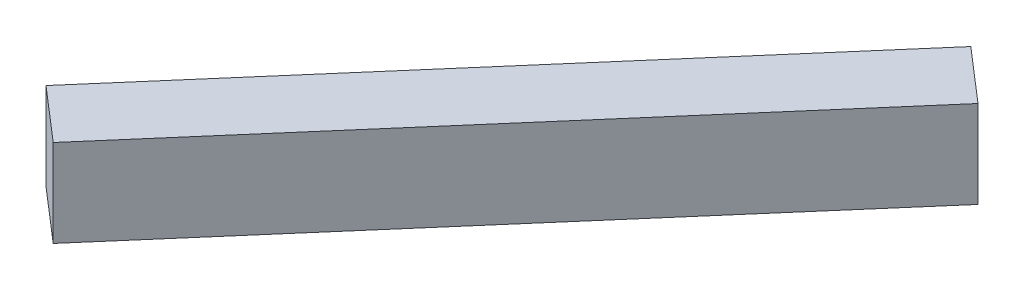
ISO-10303-21;
HEADER;
FILE_DESCRIPTION(('STEP AP214'),'2;1');
FILE_NAME('part.step','',(''),(''),'','','');
FILE_SCHEMA(('AUTOMOTIVE_DESIGN { 1 0 10303 214 1 1 1 1 }'));
ENDSEC;
DATA;
#1=APPLICATION_CONTEXT('core data for automotive mechanical design processes');
#2=APPLICATION_PROTOCOL_DEFINITION('international standard','automotive_design',2000,#1);
#3=PRODUCT_CONTEXT('',#1,'mechanical');
#4=PRODUCT('Part','Part','',(#3));
#5=PRODUCT_RELATED_PRODUCT_CATEGORY('part','',(#4));
#6=PRODUCT_DEFINITION_FORMATION('','',#4);
#7=PRODUCT_DEFINITION_CONTEXT('part definition',#1,'design');
#8=PRODUCT_DEFINITION('design','',#6,#7);
#9=PRODUCT_DEFINITION_SHAPE('','',#8);
#10=(LENGTH_UNIT() NAMED_UNIT(*) SI_UNIT(.MILLI.,.METRE.));
#11=(NAMED_UNIT(*) PLANE_ANGLE_UNIT() SI_UNIT($,.RADIAN.));
#12=(NAMED_UNIT(*) SI_UNIT($,.STERADIAN.) SOLID_ANGLE_UNIT());
#13=UNCERTAINTY_MEASURE_WITH_UNIT(LENGTH_MEASURE(1.E-05),#10,'distance_accuracy_value','');
#14=(GEOMETRIC_REPRESENTATION_CONTEXT(3) GLOBAL_UNCERTAINTY_ASSIGNED_CONTEXT((#13)) GLOBAL_UNIT_ASSIGNED_CONTEXT((#10,
#11,#12)) REPRESENTATION_CONTEXT('',''));
#15=CARTESIAN_POINT('',(0.,0.,0.));
#16=DIRECTION('',(0.,0.,1.));
#17=DIRECTION('',(1.,0.,0.));
#18=AXIS2_PLACEMENT_3D('',#15,#16,#17);
#19=CARTESIAN_POINT('',(11.6896464663056,7.874,-13.6850484400263));
#20=DIRECTION('',(0.756744104354919,0.,0.653711221048003));
#21=DIRECTION('',(0.653711221048003,0.,-0.756744104354919));
#22=AXIS2_PLACEMENT_3D('',#19,#20,#21);
#23=PLANE('',#22);
#24=DIRECTION('',(0.,1.,0.));
#25=VECTOR('',#24,1.);
#26=CARTESIAN_POINT('',(11.6896464663056,7.874,-13.6850484400263));
#27=LINE('',#26,#25);
#28=CARTESIAN_POINT('',(11.6896464663056,7.62,-13.6850484400263));
#29=VERTEX_POINT('',#28);
#30=CARTESIAN_POINT('',(11.6896464663056,7.874,-13.6850484400263));
#31=VERTEX_POINT('',#30);
#32=EDGE_CURVE('E20',#29,#31,#27,.T.);
#33=ORIENTED_EDGE('',*,*,#32,.T.);
#34=DIRECTION('',(-0.653711221048025,0.,0.7567441043549));
#35=VECTOR('',#34,1.);
#36=CARTESIAN_POINT('',(12.9349663424021,7.874,-15.1266459588224));
#37=LINE('',#36,#35);
#38=CARTESIAN_POINT('',(12.9349663424021,7.874,-15.1266459588224));
#39=VERTEX_POINT('',#38);
#40=EDGE_CURVE('E55',#39,#31,#37,.T.);
#41=ORIENTED_EDGE('',*,*,#40,.F.);
#42=DIRECTION('',(0.,1.,0.));
#43=VECTOR('',#42,1.);
#44=CARTESIAN_POINT('',(12.9349663424021,7.874,-15.1266459588224));
#45=LINE('',#44,#43);
#46=CARTESIAN_POINT('',(12.9349663424021,7.62,-15.1266459588224));
#47=VERTEX_POINT('',#46);
#48=EDGE_CURVE('E76',#39,#47,#45,.F.);
#49=ORIENTED_EDGE('',*,*,#48,.T.);
#50=DIRECTION('',(-0.653711221048025,0.,0.7567441043549));
#51=VECTOR('',#50,1.);
#52=CARTESIAN_POINT('',(12.9349663424021,7.62,-15.1266459588224));
#53=LINE('',#52,#51);
#54=EDGE_CURVE('E58',#47,#29,#53,.T.);
#55=ORIENTED_EDGE('',*,*,#54,.T.);
#56=EDGE_LOOP('',(#33,#41,#49,#55));
#57=FACE_BOUND('',#56,.T.);
#58=ADVANCED_FACE('F17',(#57),#23,.F.);
#59=CARTESIAN_POINT('',(11.6896464663056,7.874,-13.6850484400263));
#60=DIRECTION('',(0.653711221048,0.,-0.756744104354922));
#61=DIRECTION('',(-0.756744104354922,0.,-0.653711221048));
#62=AXIS2_PLACEMENT_3D('',#59,#60,#61);
#63=PLANE('',#62);
#64=DIRECTION('',(0.,1.,0.));
#65=VECTOR('',#64,1.);
#66=CARTESIAN_POINT('',(11.8434168683106,7.874,-13.5522143199093));
#67=LINE('',#66,#65);
#68=CARTESIAN_POINT('',(11.8434168683106,7.62,-13.5522143199093));
#69=VERTEX_POINT('',#68);
#70=CARTESIAN_POINT('',(11.8434168683106,7.874,-13.5522143199093));
#71=VERTEX_POINT('',#70);
#72=EDGE_CURVE('E73',#69,#71,#67,.T.);
#73=ORIENTED_EDGE('',*,*,#72,.T.);
#74=DIRECTION('',(0.756744104354977,0.,0.653711221047936));
#75=VECTOR('',#74,1.);
#76=CARTESIAN_POINT('',(11.6896464663056,7.874,-13.6850484400263));
#77=LINE('',#76,#75);
#78=EDGE_CURVE('E63',#31,#71,#77,.T.);
#79=ORIENTED_EDGE('',*,*,#78,.F.);
#80=ORIENTED_EDGE('',*,*,#32,.F.);
#81=DIRECTION('',(0.756744104354977,0.,0.653711221047936));
#82=VECTOR('',#81,1.);
#83=CARTESIAN_POINT('',(11.6896464663056,7.62,-13.6850484400263));
#84=LINE('',#83,#82);
#85=EDGE_CURVE('E80',#29,#69,#84,.T.);
#86=ORIENTED_EDGE('',*,*,#85,.T.);
#87=EDGE_LOOP('',(#73,#79,#80,#86));
#88=FACE_BOUND('',#87,.T.);
#89=ADVANCED_FACE('F72',(#88),#63,.F.);
#90=CARTESIAN_POINT('',(11.8434168683106,7.874,-13.5522143199093));
#91=DIRECTION('',(0.,1.,0.));
#92=DIRECTION('',(0.,0.,1.));
#93=AXIS2_PLACEMENT_3D('',#90,#91,#92);
#94=PLANE('',#93);
#95=DIRECTION('',(0.756744105350072,0.,0.653711219896002));
#96=VECTOR('',#95,1.);
#97=CARTESIAN_POINT('',(12.9349663424021,7.874,-15.1266459588224));
#98=LINE('',#97,#96);
#99=CARTESIAN_POINT('',(13.0887367446092,7.874,-14.9938118389395));
#100=VERTEX_POINT('',#99);
#101=EDGE_CURVE('E69',#100,#39,#98,.F.);
#102=ORIENTED_EDGE('',*,*,#101,.T.);
#103=ORIENTED_EDGE('',*,*,#40,.T.);
#104=ORIENTED_EDGE('',*,*,#78,.T.);
#105=DIRECTION('',(-0.653711221048002,0.,0.75674410435492));
#106=VECTOR('',#105,1.);
#107=CARTESIAN_POINT('',(11.8434168683106,7.874,-13.5522143199093));
#108=LINE('',#107,#106);
#109=EDGE_CURVE('E83',#71,#100,#108,.F.);
#110=ORIENTED_EDGE('',*,*,#109,.T.);
#111=EDGE_LOOP('',(#102,#103,#104,#110));
#112=FACE_BOUND('',#111,.T.);
#113=ADVANCED_FACE('F66',(#112),#94,.T.);
#114=CARTESIAN_POINT('',(12.9349663424021,7.874,-15.1266459588224));
#115=DIRECTION('',(-0.653711219896002,0.,0.756744105350072));
#116=DIRECTION('',(0.756744105350072,0.,0.653711219896002));
#117=AXIS2_PLACEMENT_3D('',#114,#115,#116);
#118=PLANE('',#117);
#119=ORIENTED_EDGE('',*,*,#48,.F.);
#120=ORIENTED_EDGE('',*,*,#101,.F.);
#121=DIRECTION('',(0.,1.,0.));
#122=VECTOR('',#121,1.);
#123=CARTESIAN_POINT('',(13.0887367446092,7.874,-14.9938118389395));
#124=LINE('',#123,#122);
#125=CARTESIAN_POINT('',(13.0887367446092,7.62,-14.9938118389395));
#126=VERTEX_POINT('',#125);
#127=EDGE_CURVE('E26',#100,#126,#124,.F.);
#128=ORIENTED_EDGE('',*,*,#127,.T.);
#129=DIRECTION('',(-0.756744105349924,0.,-0.653711219896174));
#130=VECTOR('',#129,1.);
#131=CARTESIAN_POINT('',(13.0887367446092,7.62,-14.9938118389395));
#132=LINE('',#131,#130);
#133=EDGE_CURVE('E34',#126,#47,#132,.T.);
#134=ORIENTED_EDGE('',*,*,#133,.T.);
#135=EDGE_LOOP('',(#119,#120,#128,#134));
#136=FACE_BOUND('',#135,.T.);
#137=ADVANCED_FACE('F88',(#136),#118,.F.);
#138=CARTESIAN_POINT('',(11.8434168683106,7.62,-13.5522143199093));
#139=DIRECTION('',(0.,1.,0.));
#140=DIRECTION('',(0.,0.,1.));
#141=AXIS2_PLACEMENT_3D('',#138,#139,#140);
#142=PLANE('',#141);
#143=ORIENTED_EDGE('',*,*,#54,.F.);
#144=ORIENTED_EDGE('',*,*,#133,.F.);
#145=DIRECTION('',(-0.653711221048002,0.,0.75674410435492));
#146=VECTOR('',#145,1.);
#147=CARTESIAN_POINT('',(11.8434168683106,7.62,-13.5522143199093));
#148=LINE('',#147,#146);
#149=EDGE_CURVE('E11',#126,#69,#148,.T.);
#150=ORIENTED_EDGE('',*,*,#149,.T.);
#151=ORIENTED_EDGE('',*,*,#85,.F.);
#152=EDGE_LOOP('',(#143,#144,#150,#151));
#153=FACE_BOUND('',#152,.T.);
#154=ADVANCED_FACE('F91',(#153),#142,.F.);
#155=CARTESIAN_POINT('',(11.8434168683106,7.874,-13.5522143199093));
#156=DIRECTION('',(-0.75674410435492,0.,-0.653711221048002));
#157=DIRECTION('',(-0.653711221048002,0.,0.75674410435492));
#158=AXIS2_PLACEMENT_3D('',#155,#156,#157);
#159=PLANE('',#158);
#160=ORIENTED_EDGE('',*,*,#127,.F.);
#161=ORIENTED_EDGE('',*,*,#109,.F.);
#162=ORIENTED_EDGE('',*,*,#72,.F.);
#163=ORIENTED_EDGE('',*,*,#149,.F.);
#164=EDGE_LOOP('',(#160,#161,#162,#163));
#165=FACE_BOUND('',#164,.T.);
#166=ADVANCED_FACE('F90',(#165),#159,.F.);
#167=CLOSED_SHELL('',(#58,#89,#113,#137,#154,#166));
#168=MANIFOLD_SOLID_BREP('B1',#167);
#169=ADVANCED_BREP_SHAPE_REPRESENTATION('',(#18,#168),#14);
#170=SHAPE_DEFINITION_REPRESENTATION(#9,#169);
ENDSEC;
END-ISO-10303-21;
